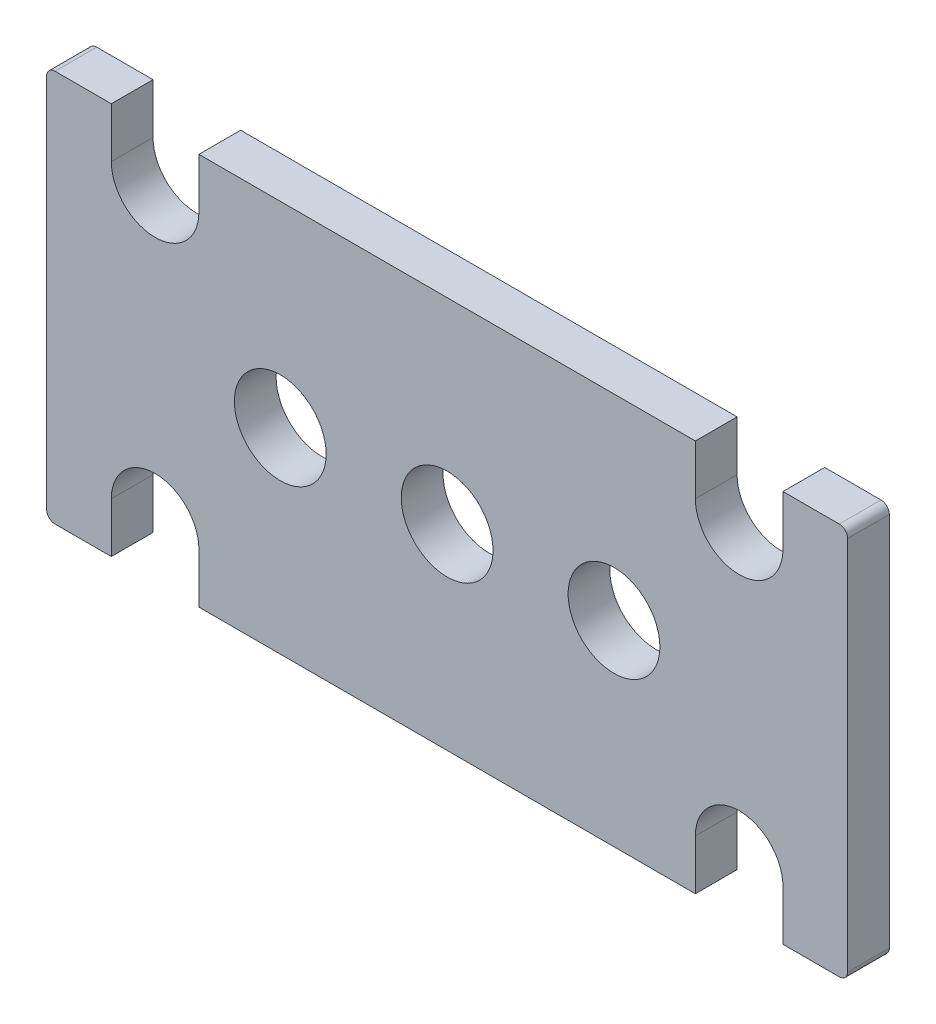
ISO-10303-21;
HEADER;
FILE_DESCRIPTION(('STEP AP214'),'2;1');
FILE_NAME('part.step','',(''),(''),'','','');
FILE_SCHEMA(('AUTOMOTIVE_DESIGN { 1 0 10303 214 1 1 1 1 }'));
ENDSEC;
DATA;
#1=APPLICATION_CONTEXT('core data for automotive mechanical design processes');
#2=APPLICATION_PROTOCOL_DEFINITION('international standard','automotive_design',2000,#1);
#3=PRODUCT_CONTEXT('',#1,'mechanical');
#4=PRODUCT('Part','Part','',(#3));
#5=PRODUCT_RELATED_PRODUCT_CATEGORY('part','',(#4));
#6=PRODUCT_DEFINITION_FORMATION('','',#4);
#7=PRODUCT_DEFINITION_CONTEXT('part definition',#1,'design');
#8=PRODUCT_DEFINITION('design','',#6,#7);
#9=PRODUCT_DEFINITION_SHAPE('','',#8);
#10=(LENGTH_UNIT() NAMED_UNIT(*) SI_UNIT(.MILLI.,.METRE.));
#11=(NAMED_UNIT(*) PLANE_ANGLE_UNIT() SI_UNIT($,.RADIAN.));
#12=(NAMED_UNIT(*) SI_UNIT($,.STERADIAN.) SOLID_ANGLE_UNIT());
#13=UNCERTAINTY_MEASURE_WITH_UNIT(LENGTH_MEASURE(1.E-05),#10,'distance_accuracy_value','');
#14=(GEOMETRIC_REPRESENTATION_CONTEXT(3) GLOBAL_UNCERTAINTY_ASSIGNED_CONTEXT((#13)) GLOBAL_UNIT_ASSIGNED_CONTEXT((#10,
#11,#12)) REPRESENTATION_CONTEXT('',''));
#15=CARTESIAN_POINT('',(0.,0.,0.));
#16=DIRECTION('',(0.,0.,1.));
#17=DIRECTION('',(1.,0.,0.));
#18=AXIS2_PLACEMENT_3D('',#15,#16,#17);
#19=CARTESIAN_POINT('',(96.,-47.,5.));
#20=DIRECTION('',(0.,1.,0.));
#21=DIRECTION('',(-1.,0.,0.));
#22=AXIS2_PLACEMENT_3D('',#19,#20,#21);
#23=PLANE('',#22);
#24=DIRECTION('',(0.,0.,1.));
#25=VECTOR('',#24,1.);
#26=CARTESIAN_POINT('',(88.25,-47.,-5.));
#27=LINE('',#26,#25);
#28=CARTESIAN_POINT('',(88.25,-47.,0.));
#29=VERTEX_POINT('',#28);
#30=CARTESIAN_POINT('',(88.25,-47.,5.));
#31=VERTEX_POINT('',#30);
#32=EDGE_CURVE('E243',#29,#31,#27,.T.);
#33=ORIENTED_EDGE('',*,*,#32,.F.);
#34=DIRECTION('',(1.,0.,0.));
#35=VECTOR('',#34,1.);
#36=CARTESIAN_POINT('',(96.,-47.,0.));
#37=LINE('',#36,#35);
#38=CARTESIAN_POINT('',(95.,-47.,0.));
#39=VERTEX_POINT('',#38);
#40=EDGE_CURVE('E305',#29,#39,#37,.T.);
#41=ORIENTED_EDGE('',*,*,#40,.T.);
#42=DIRECTION('',(0.,0.,-1.));
#43=VECTOR('',#42,1.);
#44=CARTESIAN_POINT('',(95.,-47.,5.));
#45=LINE('',#44,#43);
#46=CARTESIAN_POINT('',(95.,-47.,5.));
#47=VERTEX_POINT('',#46);
#48=EDGE_CURVE('E335',#39,#47,#45,.F.);
#49=ORIENTED_EDGE('',*,*,#48,.T.);
#50=DIRECTION('',(1.,0.,0.));
#51=VECTOR('',#50,1.);
#52=CARTESIAN_POINT('',(96.,-47.,5.));
#53=LINE('',#52,#51);
#54=EDGE_CURVE('E289',#31,#47,#53,.T.);
#55=ORIENTED_EDGE('',*,*,#54,.F.);
#56=EDGE_LOOP('',(#33,#41,#49,#55));
#57=FACE_BOUND('',#56,.T.);
#58=ADVANCED_FACE('F36',(#57),#23,.F.);
#59=CARTESIAN_POINT('',(18.25,-47.,0.));
#60=VERTEX_POINT('',#59);
#61=CARTESIAN_POINT('',(77.75,-47.,0.));
#62=VERTEX_POINT('',#61);
#63=EDGE_CURVE('E311',#60,#62,#37,.T.);
#64=ORIENTED_EDGE('',*,*,#63,.T.);
#65=DIRECTION('',(0.,0.,1.));
#66=VECTOR('',#65,1.);
#67=CARTESIAN_POINT('',(77.75,-47.,-5.));
#68=LINE('',#67,#66);
#69=CARTESIAN_POINT('',(77.75,-47.,5.));
#70=VERTEX_POINT('',#69);
#71=EDGE_CURVE('E245',#62,#70,#68,.T.);
#72=ORIENTED_EDGE('',*,*,#71,.T.);
#73=CARTESIAN_POINT('',(18.25,-47.,5.));
#74=VERTEX_POINT('',#73);
#75=EDGE_CURVE('E293',#74,#70,#53,.T.);
#76=ORIENTED_EDGE('',*,*,#75,.F.);
#77=DIRECTION('',(0.,0.,1.));
#78=VECTOR('',#77,1.);
#79=CARTESIAN_POINT('',(18.25,-47.,-5.));
#80=LINE('',#79,#78);
#81=EDGE_CURVE('E229',#60,#74,#80,.T.);
#82=ORIENTED_EDGE('',*,*,#81,.F.);
#83=EDGE_LOOP('',(#64,#72,#76,#82));
#84=FACE_BOUND('',#83,.T.);
#85=ADVANCED_FACE('F433',(#84),#23,.F.);
#86=CARTESIAN_POINT('',(0.,0.,5.));
#87=DIRECTION('',(0.,-1.,0.));
#88=DIRECTION('',(0.,0.,-1.));
#89=AXIS2_PLACEMENT_3D('',#86,#87,#88);
#90=PLANE('',#89);
#91=DIRECTION('',(0.,0.,1.));
#92=VECTOR('',#91,1.);
#93=CARTESIAN_POINT('',(77.75,0.,-5.));
#94=LINE('',#93,#92);
#95=CARTESIAN_POINT('',(77.75,0.,0.));
#96=VERTEX_POINT('',#95);
#97=CARTESIAN_POINT('',(77.75,0.,5.));
#98=VERTEX_POINT('',#97);
#99=EDGE_CURVE('E258',#96,#98,#94,.T.);
#100=ORIENTED_EDGE('',*,*,#99,.F.);
#101=DIRECTION('',(-1.,0.,0.));
#102=VECTOR('',#101,1.);
#103=CARTESIAN_POINT('',(0.,0.,0.));
#104=LINE('',#103,#102);
#105=CARTESIAN_POINT('',(18.25,0.,0.));
#106=VERTEX_POINT('',#105);
#107=EDGE_CURVE('E317',#96,#106,#104,.T.);
#108=ORIENTED_EDGE('',*,*,#107,.T.);
#109=DIRECTION('',(0.,0.,1.));
#110=VECTOR('',#109,1.);
#111=CARTESIAN_POINT('',(18.25,0.,-5.));
#112=LINE('',#111,#110);
#113=CARTESIAN_POINT('',(18.25,0.,5.));
#114=VERTEX_POINT('',#113);
#115=EDGE_CURVE('E51',#106,#114,#112,.T.);
#116=ORIENTED_EDGE('',*,*,#115,.T.);
#117=DIRECTION('',(-1.,0.,0.));
#118=VECTOR('',#117,1.);
#119=CARTESIAN_POINT('',(0.,0.,5.));
#120=LINE('',#119,#118);
#121=EDGE_CURVE('E301',#98,#114,#120,.T.);
#122=ORIENTED_EDGE('',*,*,#121,.F.);
#123=EDGE_LOOP('',(#100,#108,#116,#122));
#124=FACE_BOUND('',#123,.T.);
#125=ADVANCED_FACE('F470',(#124),#90,.F.);
#126=DIRECTION('',(0.,0.,1.));
#127=VECTOR('',#126,1.);
#128=CARTESIAN_POINT('',(7.74999999999999,0.,-5.));
#129=LINE('',#128,#127);
#130=CARTESIAN_POINT('',(7.74999999999999,0.,0.));
#131=VERTEX_POINT('',#130);
#132=CARTESIAN_POINT('',(7.74999999999999,0.,5.));
#133=VERTEX_POINT('',#132);
#134=EDGE_CURVE('E273',#131,#133,#129,.T.);
#135=ORIENTED_EDGE('',*,*,#134,.F.);
#136=CARTESIAN_POINT('',(1.,0.,0.));
#137=VERTEX_POINT('',#136);
#138=EDGE_CURVE('E314',#131,#137,#104,.T.);
#139=ORIENTED_EDGE('',*,*,#138,.T.);
#140=DIRECTION('',(0.,0.,-1.));
#141=VECTOR('',#140,1.);
#142=CARTESIAN_POINT('',(1.,0.,5.));
#143=LINE('',#142,#141);
#144=CARTESIAN_POINT('',(1.,0.,5.));
#145=VERTEX_POINT('',#144);
#146=EDGE_CURVE('E354',#137,#145,#143,.F.);
#147=ORIENTED_EDGE('',*,*,#146,.T.);
#148=EDGE_CURVE('E296',#133,#145,#120,.T.);
#149=ORIENTED_EDGE('',*,*,#148,.F.);
#150=EDGE_LOOP('',(#135,#139,#147,#149));
#151=FACE_BOUND('',#150,.T.);
#152=ADVANCED_FACE('F405',(#151),#90,.F.);
#153=CARTESIAN_POINT('',(0.,0.,5.));
#154=DIRECTION('',(0.,0.,-1.));
#155=DIRECTION('',(-1.,0.,0.));
#156=AXIS2_PLACEMENT_3D('',#153,#154,#155);
#157=PLANE('',#156);
#158=CARTESIAN_POINT('',(28.,-23.5,5.));
#159=DIRECTION('',(0.,0.,1.));
#160=DIRECTION('',(1.,0.,0.));
#161=AXIS2_PLACEMENT_3D('',#158,#159,#160);
#162=CIRCLE('',#161,5.5);
#163=CARTESIAN_POINT('',(33.5,-23.5,5.));
#164=VERTEX_POINT('',#163);
#165=EDGE_CURVE('E277',#164,#164,#162,.T.);
#166=ORIENTED_EDGE('',*,*,#165,.F.);
#167=EDGE_LOOP('',(#166));
#168=FACE_BOUND('',#167,.T.);
#169=CARTESIAN_POINT('',(48.,-23.5,5.));
#170=DIRECTION('',(0.,0.,1.));
#171=DIRECTION('',(1.,0.,0.));
#172=AXIS2_PLACEMENT_3D('',#169,#170,#171);
#173=CIRCLE('',#172,5.5);
#174=CARTESIAN_POINT('',(53.5,-23.5,5.));
#175=VERTEX_POINT('',#174);
#176=EDGE_CURVE('E281',#175,#175,#173,.T.);
#177=ORIENTED_EDGE('',*,*,#176,.F.);
#178=EDGE_LOOP('',(#177));
#179=FACE_BOUND('',#178,.T.);
#180=CARTESIAN_POINT('',(68.,-23.5,5.));
#181=DIRECTION('',(0.,0.,1.));
#182=DIRECTION('',(1.,0.,0.));
#183=AXIS2_PLACEMENT_3D('',#180,#181,#182);
#184=CIRCLE('',#183,5.5);
#185=CARTESIAN_POINT('',(73.5,-23.5,5.));
#186=VERTEX_POINT('',#185);
#187=EDGE_CURVE('E272',#186,#186,#184,.T.);
#188=ORIENTED_EDGE('',*,*,#187,.F.);
#189=EDGE_LOOP('',(#188));
#190=FACE_BOUND('',#189,.T.);
#191=DIRECTION('',(0.,1.,0.));
#192=VECTOR('',#191,1.);
#193=CARTESIAN_POINT('',(77.75,0.,5.));
#194=LINE('',#193,#192);
#195=CARTESIAN_POINT('',(77.75,-6.,5.));
#196=VERTEX_POINT('',#195);
#197=EDGE_CURVE('E254',#196,#98,#194,.T.);
#198=ORIENTED_EDGE('',*,*,#197,.T.);
#199=ORIENTED_EDGE('',*,*,#121,.T.);
#200=DIRECTION('',(0.,1.,0.));
#201=VECTOR('',#200,1.);
#202=CARTESIAN_POINT('',(18.25,0.,5.));
#203=LINE('',#202,#201);
#204=CARTESIAN_POINT('',(18.25,-6.00000000000001,5.));
#205=VERTEX_POINT('',#204);
#206=EDGE_CURVE('E264',#205,#114,#203,.T.);
#207=ORIENTED_EDGE('',*,*,#206,.F.);
#208=CARTESIAN_POINT('',(13.,-6.00000000000001,5.));
#209=DIRECTION('',(0.,0.,1.));
#210=DIRECTION('',(1.,0.,0.));
#211=AXIS2_PLACEMENT_3D('',#208,#209,#210);
#212=CIRCLE('',#211,5.25);
#213=CARTESIAN_POINT('',(7.74999999999999,-6.00000000000001,5.));
#214=VERTEX_POINT('',#213);
#215=EDGE_CURVE('E228',#205,#214,#212,.F.);
#216=ORIENTED_EDGE('',*,*,#215,.T.);
#217=DIRECTION('',(0.,1.,0.));
#218=VECTOR('',#217,1.);
#219=CARTESIAN_POINT('',(7.74999999999999,0.,5.));
#220=LINE('',#219,#218);
#221=EDGE_CURVE('E266',#214,#133,#220,.T.);
#222=ORIENTED_EDGE('',*,*,#221,.T.);
#223=ORIENTED_EDGE('',*,*,#148,.T.);
#224=CARTESIAN_POINT('',(1.,-1.,5.));
#225=DIRECTION('',(0.,0.,-1.));
#226=DIRECTION('',(-1.,0.,0.));
#227=AXIS2_PLACEMENT_3D('',#224,#225,#226);
#228=CIRCLE('',#227,1.);
#229=CARTESIAN_POINT('',(0.,-1.,5.));
#230=VERTEX_POINT('',#229);
#231=EDGE_CURVE('E340',#145,#230,#228,.F.);
#232=ORIENTED_EDGE('',*,*,#231,.T.);
#233=DIRECTION('',(0.,-1.,0.));
#234=VECTOR('',#233,1.);
#235=CARTESIAN_POINT('',(0.,-47.,5.));
#236=LINE('',#235,#234);
#237=CARTESIAN_POINT('',(0.,-46.,5.));
#238=VERTEX_POINT('',#237);
#239=EDGE_CURVE('E286',#230,#238,#236,.T.);
#240=ORIENTED_EDGE('',*,*,#239,.T.);
#241=CARTESIAN_POINT('',(1.,-46.,5.));
#242=DIRECTION('',(0.,0.,-1.));
#243=DIRECTION('',(-1.,0.,0.));
#244=AXIS2_PLACEMENT_3D('',#241,#242,#243);
#245=CIRCLE('',#244,1.);
#246=CARTESIAN_POINT('',(1.00000000000003,-47.,5.));
#247=VERTEX_POINT('',#246);
#248=EDGE_CURVE('E342',#238,#247,#245,.F.);
#249=ORIENTED_EDGE('',*,*,#248,.T.);
#250=CARTESIAN_POINT('',(7.74999999999999,-47.,5.));
#251=VERTEX_POINT('',#250);
#252=EDGE_CURVE('E223',#247,#251,#53,.T.);
#253=ORIENTED_EDGE('',*,*,#252,.T.);
#254=DIRECTION('',(0.,-1.,0.));
#255=VECTOR('',#254,1.);
#256=CARTESIAN_POINT('',(7.74999999999999,0.,5.));
#257=LINE('',#256,#255);
#258=CARTESIAN_POINT('',(7.75,-41.,5.));
#259=VERTEX_POINT('',#258);
#260=EDGE_CURVE('E200',#259,#251,#257,.T.);
#261=ORIENTED_EDGE('',*,*,#260,.F.);
#262=CARTESIAN_POINT('',(13.,-41.,5.));
#263=DIRECTION('',(0.,0.,1.));
#264=DIRECTION('',(1.,0.,0.));
#265=AXIS2_PLACEMENT_3D('',#262,#263,#264);
#266=CIRCLE('',#265,5.25);
#267=CARTESIAN_POINT('',(18.25,-41.,5.));
#268=VERTEX_POINT('',#267);
#269=EDGE_CURVE('E210',#268,#259,#266,.T.);
#270=ORIENTED_EDGE('',*,*,#269,.F.);
#271=DIRECTION('',(0.,-1.,0.));
#272=VECTOR('',#271,1.);
#273=CARTESIAN_POINT('',(18.25,0.,5.));
#274=LINE('',#273,#272);
#275=EDGE_CURVE('E207',#268,#74,#274,.T.);
#276=ORIENTED_EDGE('',*,*,#275,.T.);
#277=ORIENTED_EDGE('',*,*,#75,.T.);
#278=DIRECTION('',(0.,-1.,0.));
#279=VECTOR('',#278,1.);
#280=CARTESIAN_POINT('',(77.75,0.,5.));
#281=LINE('',#280,#279);
#282=CARTESIAN_POINT('',(77.75,-41.,5.));
#283=VERTEX_POINT('',#282);
#284=EDGE_CURVE('E235',#283,#70,#281,.T.);
#285=ORIENTED_EDGE('',*,*,#284,.F.);
#286=CARTESIAN_POINT('',(83.,-41.,5.));
#287=DIRECTION('',(0.,0.,1.));
#288=DIRECTION('',(1.,0.,0.));
#289=AXIS2_PLACEMENT_3D('',#286,#287,#288);
#290=CIRCLE('',#289,5.25);
#291=CARTESIAN_POINT('',(88.25,-41.,5.));
#292=VERTEX_POINT('',#291);
#293=EDGE_CURVE('E232',#283,#292,#290,.F.);
#294=ORIENTED_EDGE('',*,*,#293,.T.);
#295=DIRECTION('',(0.,-1.,0.));
#296=VECTOR('',#295,1.);
#297=CARTESIAN_POINT('',(88.25,0.,5.));
#298=LINE('',#297,#296);
#299=EDGE_CURVE('E238',#292,#31,#298,.T.);
#300=ORIENTED_EDGE('',*,*,#299,.T.);
#301=ORIENTED_EDGE('',*,*,#54,.T.);
#302=CARTESIAN_POINT('',(95.,-46.,5.));
#303=DIRECTION('',(0.,0.,-1.));
#304=DIRECTION('',(-1.,0.,0.));
#305=AXIS2_PLACEMENT_3D('',#302,#303,#304);
#306=CIRCLE('',#305,1.);
#307=CARTESIAN_POINT('',(96.,-46.,5.));
#308=VERTEX_POINT('',#307);
#309=EDGE_CURVE('E344',#47,#308,#306,.F.);
#310=ORIENTED_EDGE('',*,*,#309,.T.);
#311=DIRECTION('',(0.,1.,0.));
#312=VECTOR('',#311,1.);
#313=CARTESIAN_POINT('',(96.,0.,5.));
#314=LINE('',#313,#312);
#315=CARTESIAN_POINT('',(96.,-1.,5.));
#316=VERTEX_POINT('',#315);
#317=EDGE_CURVE('E292',#308,#316,#314,.T.);
#318=ORIENTED_EDGE('',*,*,#317,.T.);
#319=CARTESIAN_POINT('',(95.,-1.,5.));
#320=DIRECTION('',(0.,0.,-1.));
#321=DIRECTION('',(-1.,0.,0.));
#322=AXIS2_PLACEMENT_3D('',#319,#320,#321);
#323=CIRCLE('',#322,1.);
#324=CARTESIAN_POINT('',(95.,0.,5.));
#325=VERTEX_POINT('',#324);
#326=EDGE_CURVE('E338',#316,#325,#323,.F.);
#327=ORIENTED_EDGE('',*,*,#326,.T.);
#328=CARTESIAN_POINT('',(88.25,0.,5.));
#329=VERTEX_POINT('',#328);
#330=EDGE_CURVE('E297',#325,#329,#120,.T.);
#331=ORIENTED_EDGE('',*,*,#330,.T.);
#332=DIRECTION('',(0.,1.,0.));
#333=VECTOR('',#332,1.);
#334=CARTESIAN_POINT('',(88.25,0.,5.));
#335=LINE('',#334,#333);
#336=CARTESIAN_POINT('',(88.25,-6.,5.));
#337=VERTEX_POINT('',#336);
#338=EDGE_CURVE('E252',#337,#329,#335,.T.);
#339=ORIENTED_EDGE('',*,*,#338,.F.);
#340=CARTESIAN_POINT('',(83.,-6.,5.));
#341=DIRECTION('',(0.,0.,1.));
#342=DIRECTION('',(1.,0.,0.));
#343=AXIS2_PLACEMENT_3D('',#340,#341,#342);
#344=CIRCLE('',#343,5.25);
#345=EDGE_CURVE('E249',#196,#337,#344,.T.);
#346=ORIENTED_EDGE('',*,*,#345,.F.);
#347=EDGE_LOOP('',(#198,#199,#207,#216,#222,#223,#232,#240,#249,#253,#261,#270,#276,#277,#285,
#294,#300,#301,#310,#318,#327,#331,#339,#346));
#348=FACE_BOUND('',#347,.T.);
#349=ADVANCED_FACE('F221',(#168,#179,#190,#348),#157,.F.);
#350=CARTESIAN_POINT('',(0.,0.,0.));
#351=DIRECTION('',(0.,0.,-1.));
#352=DIRECTION('',(-1.,0.,0.));
#353=AXIS2_PLACEMENT_3D('',#350,#351,#352);
#354=PLANE('',#353);
#355=CARTESIAN_POINT('',(28.,-23.5,0.));
#356=DIRECTION('',(0.,0.,-1.));
#357=DIRECTION('',(-1.,0.,0.));
#358=AXIS2_PLACEMENT_3D('',#355,#356,#357);
#359=CIRCLE('',#358,5.5);
#360=CARTESIAN_POINT('',(22.5,-23.5,0.));
#361=VERTEX_POINT('',#360);
#362=EDGE_CURVE('E306',#361,#361,#359,.T.);
#363=ORIENTED_EDGE('',*,*,#362,.F.);
#364=EDGE_LOOP('',(#363));
#365=FACE_BOUND('',#364,.T.);
#366=CARTESIAN_POINT('',(48.,-23.5,0.));
#367=DIRECTION('',(0.,0.,-1.));
#368=DIRECTION('',(-1.,0.,0.));
#369=AXIS2_PLACEMENT_3D('',#366,#367,#368);
#370=CIRCLE('',#369,5.5);
#371=CARTESIAN_POINT('',(42.5,-23.5,0.));
#372=VERTEX_POINT('',#371);
#373=EDGE_CURVE('E360',#372,#372,#370,.T.);
#374=ORIENTED_EDGE('',*,*,#373,.F.);
#375=EDGE_LOOP('',(#374));
#376=FACE_BOUND('',#375,.T.);
#377=CARTESIAN_POINT('',(68.,-23.5,0.));
#378=DIRECTION('',(0.,0.,-1.));
#379=DIRECTION('',(-1.,0.,0.));
#380=AXIS2_PLACEMENT_3D('',#377,#378,#379);
#381=CIRCLE('',#380,5.5);
#382=CARTESIAN_POINT('',(62.5,-23.5,0.));
#383=VERTEX_POINT('',#382);
#384=EDGE_CURVE('E280',#383,#383,#381,.T.);
#385=ORIENTED_EDGE('',*,*,#384,.F.);
#386=EDGE_LOOP('',(#385));
#387=FACE_BOUND('',#386,.T.);
#388=ORIENTED_EDGE('',*,*,#107,.F.);
#389=DIRECTION('',(0.,-1.,0.));
#390=VECTOR('',#389,1.);
#391=CARTESIAN_POINT('',(77.75,0.,0.));
#392=LINE('',#391,#390);
#393=CARTESIAN_POINT('',(77.75,-6.,0.));
#394=VERTEX_POINT('',#393);
#395=EDGE_CURVE('E11',#96,#394,#392,.T.);
#396=ORIENTED_EDGE('',*,*,#395,.T.);
#397=CARTESIAN_POINT('',(83.,-6.,0.));
#398=DIRECTION('',(0.,0.,-1.));
#399=DIRECTION('',(-1.,0.,0.));
#400=AXIS2_PLACEMENT_3D('',#397,#398,#399);
#401=CIRCLE('',#400,5.25);
#402=CARTESIAN_POINT('',(88.25,-6.,0.));
#403=VERTEX_POINT('',#402);
#404=EDGE_CURVE('E44',#403,#394,#401,.T.);
#405=ORIENTED_EDGE('',*,*,#404,.F.);
#406=DIRECTION('',(0.,-1.,0.));
#407=VECTOR('',#406,1.);
#408=CARTESIAN_POINT('',(88.25,0.,0.));
#409=LINE('',#408,#407);
#410=CARTESIAN_POINT('',(88.25,0.,0.));
#411=VERTEX_POINT('',#410);
#412=EDGE_CURVE('E386',#411,#403,#409,.T.);
#413=ORIENTED_EDGE('',*,*,#412,.F.);
#414=CARTESIAN_POINT('',(95.,0.,0.));
#415=VERTEX_POINT('',#414);
#416=EDGE_CURVE('E290',#415,#411,#104,.T.);
#417=ORIENTED_EDGE('',*,*,#416,.F.);
#418=CARTESIAN_POINT('',(95.,-1.,0.));
#419=DIRECTION('',(0.,0.,-1.));
#420=DIRECTION('',(-1.,0.,0.));
#421=AXIS2_PLACEMENT_3D('',#418,#419,#420);
#422=CIRCLE('',#421,1.);
#423=CARTESIAN_POINT('',(96.,-1.,0.));
#424=VERTEX_POINT('',#423);
#425=EDGE_CURVE('E322',#415,#424,#422,.T.);
#426=ORIENTED_EDGE('',*,*,#425,.T.);
#427=DIRECTION('',(0.,1.,0.));
#428=VECTOR('',#427,1.);
#429=CARTESIAN_POINT('',(96.,0.,0.));
#430=LINE('',#429,#428);
#431=CARTESIAN_POINT('',(96.,-46.,0.));
#432=VERTEX_POINT('',#431);
#433=EDGE_CURVE('E310',#432,#424,#430,.T.);
#434=ORIENTED_EDGE('',*,*,#433,.F.);
#435=CARTESIAN_POINT('',(95.,-46.,0.));
#436=DIRECTION('',(0.,0.,-1.));
#437=DIRECTION('',(-1.,0.,0.));
#438=AXIS2_PLACEMENT_3D('',#435,#436,#437);
#439=CIRCLE('',#438,1.);
#440=EDGE_CURVE('E329',#432,#39,#439,.T.);
#441=ORIENTED_EDGE('',*,*,#440,.T.);
#442=ORIENTED_EDGE('',*,*,#40,.F.);
#443=DIRECTION('',(0.,1.,0.));
#444=VECTOR('',#443,1.);
#445=CARTESIAN_POINT('',(88.25,0.,0.));
#446=LINE('',#445,#444);
#447=CARTESIAN_POINT('',(88.25,-41.,0.));
#448=VERTEX_POINT('',#447);
#449=EDGE_CURVE('E383',#29,#448,#446,.T.);
#450=ORIENTED_EDGE('',*,*,#449,.T.);
#451=CARTESIAN_POINT('',(83.,-41.,0.));
#452=DIRECTION('',(0.,0.,-1.));
#453=DIRECTION('',(-1.,0.,0.));
#454=AXIS2_PLACEMENT_3D('',#451,#452,#453);
#455=CIRCLE('',#454,5.25);
#456=CARTESIAN_POINT('',(77.75,-41.,0.));
#457=VERTEX_POINT('',#456);
#458=EDGE_CURVE('E380',#448,#457,#455,.F.);
#459=ORIENTED_EDGE('',*,*,#458,.T.);
#460=DIRECTION('',(0.,1.,0.));
#461=VECTOR('',#460,1.);
#462=CARTESIAN_POINT('',(77.75,0.,0.));
#463=LINE('',#462,#461);
#464=EDGE_CURVE('E378',#62,#457,#463,.T.);
#465=ORIENTED_EDGE('',*,*,#464,.F.);
#466=ORIENTED_EDGE('',*,*,#63,.F.);
#467=DIRECTION('',(0.,1.,0.));
#468=VECTOR('',#467,1.);
#469=CARTESIAN_POINT('',(18.25,0.,0.));
#470=LINE('',#469,#468);
#471=CARTESIAN_POINT('',(18.25,-41.,0.));
#472=VERTEX_POINT('',#471);
#473=EDGE_CURVE('E375',#60,#472,#470,.T.);
#474=ORIENTED_EDGE('',*,*,#473,.T.);
#475=CARTESIAN_POINT('',(13.,-41.,0.));
#476=DIRECTION('',(0.,0.,-1.));
#477=DIRECTION('',(-1.,0.,0.));
#478=AXIS2_PLACEMENT_3D('',#475,#476,#477);
#479=CIRCLE('',#478,5.25);
#480=CARTESIAN_POINT('',(7.75,-41.,0.));
#481=VERTEX_POINT('',#480);
#482=EDGE_CURVE('E373',#481,#472,#479,.T.);
#483=ORIENTED_EDGE('',*,*,#482,.F.);
#484=DIRECTION('',(0.,1.,0.));
#485=VECTOR('',#484,1.);
#486=CARTESIAN_POINT('',(7.74999999999999,0.,0.));
#487=LINE('',#486,#485);
#488=CARTESIAN_POINT('',(7.75000000000002,-47.,0.));
#489=VERTEX_POINT('',#488);
#490=EDGE_CURVE('E203',#489,#481,#487,.T.);
#491=ORIENTED_EDGE('',*,*,#490,.F.);
#492=CARTESIAN_POINT('',(1.00000000000003,-47.,0.));
#493=VERTEX_POINT('',#492);
#494=EDGE_CURVE('E307',#493,#489,#37,.T.);
#495=ORIENTED_EDGE('',*,*,#494,.F.);
#496=CARTESIAN_POINT('',(1.,-46.,0.));
#497=DIRECTION('',(0.,0.,-1.));
#498=DIRECTION('',(-1.,0.,0.));
#499=AXIS2_PLACEMENT_3D('',#496,#497,#498);
#500=CIRCLE('',#499,1.);
#501=CARTESIAN_POINT('',(0.,-46.,0.));
#502=VERTEX_POINT('',#501);
#503=EDGE_CURVE('E327',#493,#502,#500,.T.);
#504=ORIENTED_EDGE('',*,*,#503,.T.);
#505=DIRECTION('',(0.,-1.,0.));
#506=VECTOR('',#505,1.);
#507=CARTESIAN_POINT('',(0.,-47.,0.));
#508=LINE('',#507,#506);
#509=CARTESIAN_POINT('',(0.,-1.,0.));
#510=VERTEX_POINT('',#509);
#511=EDGE_CURVE('E302',#510,#502,#508,.T.);
#512=ORIENTED_EDGE('',*,*,#511,.F.);
#513=CARTESIAN_POINT('',(1.,-1.,0.));
#514=DIRECTION('',(0.,0.,-1.));
#515=DIRECTION('',(-1.,0.,0.));
#516=AXIS2_PLACEMENT_3D('',#513,#514,#515);
#517=CIRCLE('',#516,1.);
#518=EDGE_CURVE('E324',#510,#137,#517,.T.);
#519=ORIENTED_EDGE('',*,*,#518,.T.);
#520=ORIENTED_EDGE('',*,*,#138,.F.);
#521=DIRECTION('',(0.,-1.,0.));
#522=VECTOR('',#521,1.);
#523=CARTESIAN_POINT('',(7.74999999999999,0.,0.));
#524=LINE('',#523,#522);
#525=CARTESIAN_POINT('',(7.74999999999999,-6.00000000000001,0.));
#526=VERTEX_POINT('',#525);
#527=EDGE_CURVE('E369',#131,#526,#524,.T.);
#528=ORIENTED_EDGE('',*,*,#527,.T.);
#529=CARTESIAN_POINT('',(13.,-6.00000000000001,0.));
#530=DIRECTION('',(0.,0.,-1.));
#531=DIRECTION('',(-1.,0.,0.));
#532=AXIS2_PLACEMENT_3D('',#529,#530,#531);
#533=CIRCLE('',#532,5.25);
#534=CARTESIAN_POINT('',(18.25,-6.00000000000001,0.));
#535=VERTEX_POINT('',#534);
#536=EDGE_CURVE('E366',#526,#535,#533,.F.);
#537=ORIENTED_EDGE('',*,*,#536,.T.);
#538=DIRECTION('',(0.,-1.,0.));
#539=VECTOR('',#538,1.);
#540=CARTESIAN_POINT('',(18.25,0.,0.));
#541=LINE('',#540,#539);
#542=EDGE_CURVE('E357',#106,#535,#541,.T.);
#543=ORIENTED_EDGE('',*,*,#542,.F.);
#544=EDGE_LOOP('',(#388,#396,#405,#413,#417,#426,#434,#441,#442,#450,#459,#465,#466,#474,#483,
#491,#495,#504,#512,#519,#520,#528,#537,#543));
#545=FACE_BOUND('',#544,.T.);
#546=ADVANCED_FACE('F399',(#365,#376,#387,#545),#354,.T.);
#547=CARTESIAN_POINT('',(0.,-47.,5.));
#548=DIRECTION('',(1.,0.,0.));
#549=DIRECTION('',(0.,1.,0.));
#550=AXIS2_PLACEMENT_3D('',#547,#548,#549);
#551=PLANE('',#550);
#552=ORIENTED_EDGE('',*,*,#511,.T.);
#553=DIRECTION('',(0.,0.,-1.));
#554=VECTOR('',#553,1.);
#555=CARTESIAN_POINT('',(0.,-46.,5.));
#556=LINE('',#555,#554);
#557=EDGE_CURVE('E349',#502,#238,#556,.F.);
#558=ORIENTED_EDGE('',*,*,#557,.T.);
#559=ORIENTED_EDGE('',*,*,#239,.F.);
#560=DIRECTION('',(0.,0.,-1.));
#561=VECTOR('',#560,1.);
#562=CARTESIAN_POINT('',(0.,-1.,5.));
#563=LINE('',#562,#561);
#564=EDGE_CURVE('E346',#230,#510,#563,.T.);
#565=ORIENTED_EDGE('',*,*,#564,.T.);
#566=EDGE_LOOP('',(#552,#558,#559,#565));
#567=FACE_BOUND('',#566,.T.);
#568=ADVANCED_FACE('F416',(#567),#551,.F.);
#569=ORIENTED_EDGE('',*,*,#494,.T.);
#570=DIRECTION('',(0.,0.,1.));
#571=VECTOR('',#570,1.);
#572=CARTESIAN_POINT('',(7.74999999999999,-47.,-5.));
#573=LINE('',#572,#571);
#574=EDGE_CURVE('E206',#489,#251,#573,.T.);
#575=ORIENTED_EDGE('',*,*,#574,.T.);
#576=ORIENTED_EDGE('',*,*,#252,.F.);
#577=DIRECTION('',(0.,0.,-1.));
#578=VECTOR('',#577,1.);
#579=CARTESIAN_POINT('',(1.,-47.,5.));
#580=LINE('',#579,#578);
#581=EDGE_CURVE('E332',#247,#493,#580,.T.);
#582=ORIENTED_EDGE('',*,*,#581,.T.);
#583=EDGE_LOOP('',(#569,#575,#576,#582));
#584=FACE_BOUND('',#583,.T.);
#585=ADVANCED_FACE('F422',(#584),#23,.F.);
#586=CARTESIAN_POINT('',(96.,0.,5.));
#587=DIRECTION('',(-1.,0.,0.));
#588=DIRECTION('',(0.,-1.,0.));
#589=AXIS2_PLACEMENT_3D('',#586,#587,#588);
#590=PLANE('',#589);
#591=ORIENTED_EDGE('',*,*,#317,.F.);
#592=DIRECTION('',(0.,0.,-1.));
#593=VECTOR('',#592,1.);
#594=CARTESIAN_POINT('',(96.,-46.,5.));
#595=LINE('',#594,#593);
#596=EDGE_CURVE('E319',#308,#432,#595,.T.);
#597=ORIENTED_EDGE('',*,*,#596,.T.);
#598=ORIENTED_EDGE('',*,*,#433,.T.);
#599=DIRECTION('',(0.,0.,-1.));
#600=VECTOR('',#599,1.);
#601=CARTESIAN_POINT('',(96.,-1.,5.));
#602=LINE('',#601,#600);
#603=EDGE_CURVE('E300',#424,#316,#602,.F.);
#604=ORIENTED_EDGE('',*,*,#603,.T.);
#605=EDGE_LOOP('',(#591,#597,#598,#604));
#606=FACE_BOUND('',#605,.T.);
#607=ADVANCED_FACE('F447',(#606),#590,.F.);
#608=ORIENTED_EDGE('',*,*,#416,.T.);
#609=DIRECTION('',(0.,0.,1.));
#610=VECTOR('',#609,1.);
#611=CARTESIAN_POINT('',(88.25,0.,-5.));
#612=LINE('',#611,#610);
#613=EDGE_CURVE('E59',#411,#329,#612,.T.);
#614=ORIENTED_EDGE('',*,*,#613,.T.);
#615=ORIENTED_EDGE('',*,*,#330,.F.);
#616=DIRECTION('',(0.,0.,-1.));
#617=VECTOR('',#616,1.);
#618=CARTESIAN_POINT('',(95.,0.,5.));
#619=LINE('',#618,#617);
#620=EDGE_CURVE('E351',#325,#415,#619,.T.);
#621=ORIENTED_EDGE('',*,*,#620,.T.);
#622=EDGE_LOOP('',(#608,#614,#615,#621));
#623=FACE_BOUND('',#622,.T.);
#624=ADVANCED_FACE('F455',(#623),#90,.F.);
#625=CARTESIAN_POINT('',(95.,-46.,5.));
#626=DIRECTION('',(0.,0.,-1.));
#627=DIRECTION('',(-1.,0.,0.));
#628=AXIS2_PLACEMENT_3D('',#625,#626,#627);
#629=CYLINDRICAL_SURFACE('',#628,1.);
#630=ORIENTED_EDGE('',*,*,#309,.F.);
#631=ORIENTED_EDGE('',*,*,#48,.F.);
#632=ORIENTED_EDGE('',*,*,#440,.F.);
#633=ORIENTED_EDGE('',*,*,#596,.F.);
#634=EDGE_LOOP('',(#630,#631,#632,#633));
#635=FACE_BOUND('',#634,.T.);
#636=ADVANCED_FACE('F444',(#635),#629,.T.);
#637=CARTESIAN_POINT('',(1.,-46.,5.));
#638=DIRECTION('',(0.,0.,-1.));
#639=DIRECTION('',(-1.,0.,0.));
#640=AXIS2_PLACEMENT_3D('',#637,#638,#639);
#641=CYLINDRICAL_SURFACE('',#640,1.);
#642=ORIENTED_EDGE('',*,*,#248,.F.);
#643=ORIENTED_EDGE('',*,*,#557,.F.);
#644=ORIENTED_EDGE('',*,*,#503,.F.);
#645=ORIENTED_EDGE('',*,*,#581,.F.);
#646=EDGE_LOOP('',(#642,#643,#644,#645));
#647=FACE_BOUND('',#646,.T.);
#648=ADVANCED_FACE('F419',(#647),#641,.T.);
#649=CARTESIAN_POINT('',(1.,-1.,5.));
#650=DIRECTION('',(0.,0.,-1.));
#651=DIRECTION('',(-1.,0.,0.));
#652=AXIS2_PLACEMENT_3D('',#649,#650,#651);
#653=CYLINDRICAL_SURFACE('',#652,1.);
#654=ORIENTED_EDGE('',*,*,#231,.F.);
#655=ORIENTED_EDGE('',*,*,#146,.F.);
#656=ORIENTED_EDGE('',*,*,#518,.F.);
#657=ORIENTED_EDGE('',*,*,#564,.F.);
#658=EDGE_LOOP('',(#654,#655,#656,#657));
#659=FACE_BOUND('',#658,.T.);
#660=ADVANCED_FACE('F412',(#659),#653,.T.);
#661=CARTESIAN_POINT('',(95.,-1.,5.));
#662=DIRECTION('',(0.,0.,-1.));
#663=DIRECTION('',(-1.,0.,0.));
#664=AXIS2_PLACEMENT_3D('',#661,#662,#663);
#665=CYLINDRICAL_SURFACE('',#664,1.);
#666=ORIENTED_EDGE('',*,*,#326,.F.);
#667=ORIENTED_EDGE('',*,*,#603,.F.);
#668=ORIENTED_EDGE('',*,*,#425,.F.);
#669=ORIENTED_EDGE('',*,*,#620,.F.);
#670=EDGE_LOOP('',(#666,#667,#668,#669));
#671=FACE_BOUND('',#670,.T.);
#672=ADVANCED_FACE('F38',(#671),#665,.T.);
#673=CARTESIAN_POINT('',(68.,-23.5,-5.));
#674=DIRECTION('',(0.,0.,1.));
#675=DIRECTION('',(1.,0.,0.));
#676=AXIS2_PLACEMENT_3D('',#673,#674,#675);
#677=CYLINDRICAL_SURFACE('',#676,5.5);
#678=ORIENTED_EDGE('',*,*,#384,.T.);
#679=EDGE_LOOP('',(#678));
#680=FACE_BOUND('',#679,.T.);
#681=ORIENTED_EDGE('',*,*,#187,.T.);
#682=EDGE_LOOP('',(#681));
#683=FACE_BOUND('',#682,.T.);
#684=ADVANCED_FACE('F491',(#680,#683),#677,.F.);
#685=CARTESIAN_POINT('',(48.,-23.5,-5.));
#686=DIRECTION('',(0.,0.,1.));
#687=DIRECTION('',(1.,0.,0.));
#688=AXIS2_PLACEMENT_3D('',#685,#686,#687);
#689=CYLINDRICAL_SURFACE('',#688,5.5);
#690=ORIENTED_EDGE('',*,*,#373,.T.);
#691=EDGE_LOOP('',(#690));
#692=FACE_BOUND('',#691,.T.);
#693=ORIENTED_EDGE('',*,*,#176,.T.);
#694=EDGE_LOOP('',(#693));
#695=FACE_BOUND('',#694,.T.);
#696=ADVANCED_FACE('F495',(#692,#695),#689,.F.);
#697=CARTESIAN_POINT('',(28.,-23.5,-5.));
#698=DIRECTION('',(0.,0.,1.));
#699=DIRECTION('',(1.,0.,0.));
#700=AXIS2_PLACEMENT_3D('',#697,#698,#699);
#701=CYLINDRICAL_SURFACE('',#700,5.5);
#702=ORIENTED_EDGE('',*,*,#362,.T.);
#703=EDGE_LOOP('',(#702));
#704=FACE_BOUND('',#703,.T.);
#705=ORIENTED_EDGE('',*,*,#165,.T.);
#706=EDGE_LOOP('',(#705));
#707=FACE_BOUND('',#706,.T.);
#708=ADVANCED_FACE('F501',(#704,#707),#701,.F.);
#709=CARTESIAN_POINT('',(13.,-6.00000000000001,-5.));
#710=DIRECTION('',(0.,0.,1.));
#711=DIRECTION('',(1.,0.,0.));
#712=AXIS2_PLACEMENT_3D('',#709,#710,#711);
#713=CYLINDRICAL_SURFACE('',#712,5.25);
#714=DIRECTION('',(0.,0.,1.));
#715=VECTOR('',#714,1.);
#716=CARTESIAN_POINT('',(7.74999999999999,-6.00000000000001,-5.));
#717=LINE('',#716,#715);
#718=EDGE_CURVE('E270',#526,#214,#717,.T.);
#719=ORIENTED_EDGE('',*,*,#718,.T.);
#720=ORIENTED_EDGE('',*,*,#215,.F.);
#721=DIRECTION('',(0.,0.,1.));
#722=VECTOR('',#721,1.);
#723=CARTESIAN_POINT('',(18.25,-6.00000000000001,-5.));
#724=LINE('',#723,#722);
#725=EDGE_CURVE('E269',#535,#205,#724,.T.);
#726=ORIENTED_EDGE('',*,*,#725,.F.);
#727=ORIENTED_EDGE('',*,*,#536,.F.);
#728=EDGE_LOOP('',(#719,#720,#726,#727));
#729=FACE_BOUND('',#728,.T.);
#730=ADVANCED_FACE('F544',(#729),#713,.F.);
#731=CARTESIAN_POINT('',(7.74999999999999,0.,-5.));
#732=DIRECTION('',(1.,0.,0.));
#733=DIRECTION('',(0.,0.,-1.));
#734=AXIS2_PLACEMENT_3D('',#731,#732,#733);
#735=PLANE('',#734);
#736=ORIENTED_EDGE('',*,*,#134,.T.);
#737=ORIENTED_EDGE('',*,*,#221,.F.);
#738=ORIENTED_EDGE('',*,*,#718,.F.);
#739=ORIENTED_EDGE('',*,*,#527,.F.);
#740=EDGE_LOOP('',(#736,#737,#738,#739));
#741=FACE_BOUND('',#740,.T.);
#742=ADVANCED_FACE('F549',(#741),#735,.T.);
#743=CARTESIAN_POINT('',(18.25,0.,-5.));
#744=DIRECTION('',(1.,0.,0.));
#745=DIRECTION('',(0.,0.,-1.));
#746=AXIS2_PLACEMENT_3D('',#743,#744,#745);
#747=PLANE('',#746);
#748=ORIENTED_EDGE('',*,*,#542,.T.);
#749=ORIENTED_EDGE('',*,*,#725,.T.);
#750=ORIENTED_EDGE('',*,*,#206,.T.);
#751=ORIENTED_EDGE('',*,*,#115,.F.);
#752=EDGE_LOOP('',(#748,#749,#750,#751));
#753=FACE_BOUND('',#752,.T.);
#754=ADVANCED_FACE('F561',(#753),#747,.F.);
#755=CARTESIAN_POINT('',(13.,-41.,-5.));
#756=DIRECTION('',(0.,0.,1.));
#757=DIRECTION('',(1.,0.,0.));
#758=AXIS2_PLACEMENT_3D('',#755,#756,#757);
#759=CYLINDRICAL_SURFACE('',#758,5.25);
#760=ORIENTED_EDGE('',*,*,#482,.T.);
#761=DIRECTION('',(0.,0.,1.));
#762=VECTOR('',#761,1.);
#763=CARTESIAN_POINT('',(18.25,-41.,-5.));
#764=LINE('',#763,#762);
#765=EDGE_CURVE('E213',#472,#268,#764,.T.);
#766=ORIENTED_EDGE('',*,*,#765,.T.);
#767=ORIENTED_EDGE('',*,*,#269,.T.);
#768=DIRECTION('',(0.,0.,1.));
#769=VECTOR('',#768,1.);
#770=CARTESIAN_POINT('',(7.75,-41.,-5.));
#771=LINE('',#770,#769);
#772=EDGE_CURVE('E196',#481,#259,#771,.T.);
#773=ORIENTED_EDGE('',*,*,#772,.F.);
#774=EDGE_LOOP('',(#760,#766,#767,#773));
#775=FACE_BOUND('',#774,.T.);
#776=ADVANCED_FACE('F211',(#775),#759,.F.);
#777=CARTESIAN_POINT('',(18.25,0.,-5.));
#778=DIRECTION('',(-1.,0.,0.));
#779=DIRECTION('',(0.,0.,1.));
#780=AXIS2_PLACEMENT_3D('',#777,#778,#779);
#781=PLANE('',#780);
#782=ORIENTED_EDGE('',*,*,#81,.T.);
#783=ORIENTED_EDGE('',*,*,#275,.F.);
#784=ORIENTED_EDGE('',*,*,#765,.F.);
#785=ORIENTED_EDGE('',*,*,#473,.F.);
#786=EDGE_LOOP('',(#782,#783,#784,#785));
#787=FACE_BOUND('',#786,.T.);
#788=ADVANCED_FACE('F426',(#787),#781,.T.);
#789=CARTESIAN_POINT('',(7.74999999999999,0.,-5.));
#790=DIRECTION('',(-1.,0.,0.));
#791=DIRECTION('',(0.,0.,1.));
#792=AXIS2_PLACEMENT_3D('',#789,#790,#791);
#793=PLANE('',#792);
#794=ORIENTED_EDGE('',*,*,#490,.T.);
#795=ORIENTED_EDGE('',*,*,#772,.T.);
#796=ORIENTED_EDGE('',*,*,#260,.T.);
#797=ORIENTED_EDGE('',*,*,#574,.F.);
#798=EDGE_LOOP('',(#794,#795,#796,#797));
#799=FACE_BOUND('',#798,.T.);
#800=ADVANCED_FACE('F198',(#799),#793,.F.);
#801=CARTESIAN_POINT('',(83.,-41.,-5.));
#802=DIRECTION('',(0.,0.,1.));
#803=DIRECTION('',(1.,0.,0.));
#804=AXIS2_PLACEMENT_3D('',#801,#802,#803);
#805=CYLINDRICAL_SURFACE('',#804,5.25);
#806=DIRECTION('',(0.,0.,1.));
#807=VECTOR('',#806,1.);
#808=CARTESIAN_POINT('',(88.25,-41.,-5.));
#809=LINE('',#808,#807);
#810=EDGE_CURVE('E217',#448,#292,#809,.T.);
#811=ORIENTED_EDGE('',*,*,#810,.T.);
#812=ORIENTED_EDGE('',*,*,#293,.F.);
#813=DIRECTION('',(0.,0.,1.));
#814=VECTOR('',#813,1.);
#815=CARTESIAN_POINT('',(77.75,-41.,-5.));
#816=LINE('',#815,#814);
#817=EDGE_CURVE('E241',#457,#283,#816,.T.);
#818=ORIENTED_EDGE('',*,*,#817,.F.);
#819=ORIENTED_EDGE('',*,*,#458,.F.);
#820=EDGE_LOOP('',(#811,#812,#818,#819));
#821=FACE_BOUND('',#820,.T.);
#822=ADVANCED_FACE('F595',(#821),#805,.F.);
#823=CARTESIAN_POINT('',(88.25,0.,-5.));
#824=DIRECTION('',(-1.,0.,0.));
#825=DIRECTION('',(0.,0.,1.));
#826=AXIS2_PLACEMENT_3D('',#823,#824,#825);
#827=PLANE('',#826);
#828=ORIENTED_EDGE('',*,*,#32,.T.);
#829=ORIENTED_EDGE('',*,*,#299,.F.);
#830=ORIENTED_EDGE('',*,*,#810,.F.);
#831=ORIENTED_EDGE('',*,*,#449,.F.);
#832=EDGE_LOOP('',(#828,#829,#830,#831));
#833=FACE_BOUND('',#832,.T.);
#834=ADVANCED_FACE('F604',(#833),#827,.T.);
#835=CARTESIAN_POINT('',(77.75,0.,-5.));
#836=DIRECTION('',(-1.,0.,0.));
#837=DIRECTION('',(0.,0.,1.));
#838=AXIS2_PLACEMENT_3D('',#835,#836,#837);
#839=PLANE('',#838);
#840=ORIENTED_EDGE('',*,*,#464,.T.);
#841=ORIENTED_EDGE('',*,*,#817,.T.);
#842=ORIENTED_EDGE('',*,*,#284,.T.);
#843=ORIENTED_EDGE('',*,*,#71,.F.);
#844=EDGE_LOOP('',(#840,#841,#842,#843));
#845=FACE_BOUND('',#844,.T.);
#846=ADVANCED_FACE('F614',(#845),#839,.F.);
#847=CARTESIAN_POINT('',(83.,-6.,-5.));
#848=DIRECTION('',(0.,0.,1.));
#849=DIRECTION('',(1.,0.,0.));
#850=AXIS2_PLACEMENT_3D('',#847,#848,#849);
#851=CYLINDRICAL_SURFACE('',#850,5.25);
#852=ORIENTED_EDGE('',*,*,#404,.T.);
#853=DIRECTION('',(0.,0.,1.));
#854=VECTOR('',#853,1.);
#855=CARTESIAN_POINT('',(77.75,-6.,-5.));
#856=LINE('',#855,#854);
#857=EDGE_CURVE('E236',#394,#196,#856,.T.);
#858=ORIENTED_EDGE('',*,*,#857,.T.);
#859=ORIENTED_EDGE('',*,*,#345,.T.);
#860=DIRECTION('',(0.,0.,1.));
#861=VECTOR('',#860,1.);
#862=CARTESIAN_POINT('',(88.25,-6.,-5.));
#863=LINE('',#862,#861);
#864=EDGE_CURVE('E256',#403,#337,#863,.T.);
#865=ORIENTED_EDGE('',*,*,#864,.F.);
#866=EDGE_LOOP('',(#852,#858,#859,#865));
#867=FACE_BOUND('',#866,.T.);
#868=ADVANCED_FACE('F391',(#867),#851,.F.);
#869=CARTESIAN_POINT('',(77.75,0.,-5.));
#870=DIRECTION('',(1.,0.,0.));
#871=DIRECTION('',(0.,0.,-1.));
#872=AXIS2_PLACEMENT_3D('',#869,#870,#871);
#873=PLANE('',#872);
#874=ORIENTED_EDGE('',*,*,#99,.T.);
#875=ORIENTED_EDGE('',*,*,#197,.F.);
#876=ORIENTED_EDGE('',*,*,#857,.F.);
#877=ORIENTED_EDGE('',*,*,#395,.F.);
#878=EDGE_LOOP('',(#874,#875,#876,#877));
#879=FACE_BOUND('',#878,.T.);
#880=ADVANCED_FACE('F395',(#879),#873,.T.);
#881=CARTESIAN_POINT('',(88.25,0.,-5.));
#882=DIRECTION('',(1.,0.,0.));
#883=DIRECTION('',(0.,0.,-1.));
#884=AXIS2_PLACEMENT_3D('',#881,#882,#883);
#885=PLANE('',#884);
#886=ORIENTED_EDGE('',*,*,#412,.T.);
#887=ORIENTED_EDGE('',*,*,#864,.T.);
#888=ORIENTED_EDGE('',*,*,#338,.T.);
#889=ORIENTED_EDGE('',*,*,#613,.F.);
#890=EDGE_LOOP('',(#886,#887,#888,#889));
#891=FACE_BOUND('',#890,.T.);
#892=ADVANCED_FACE('F457',(#891),#885,.F.);
#893=CLOSED_SHELL('',(#58,#85,#125,#152,#349,#546,#568,#585,#607,#624,#636,#648,#660,#672,#684,
#696,#708,#730,#742,#754,#776,#788,#800,#822,#834,#846,#868,#880,#892));
#894=MANIFOLD_SOLID_BREP('B2',#893);
#895=ADVANCED_BREP_SHAPE_REPRESENTATION('',(#18,#894),#14);
#896=SHAPE_DEFINITION_REPRESENTATION(#9,#895);
ENDSEC;
END-ISO-10303-21;
